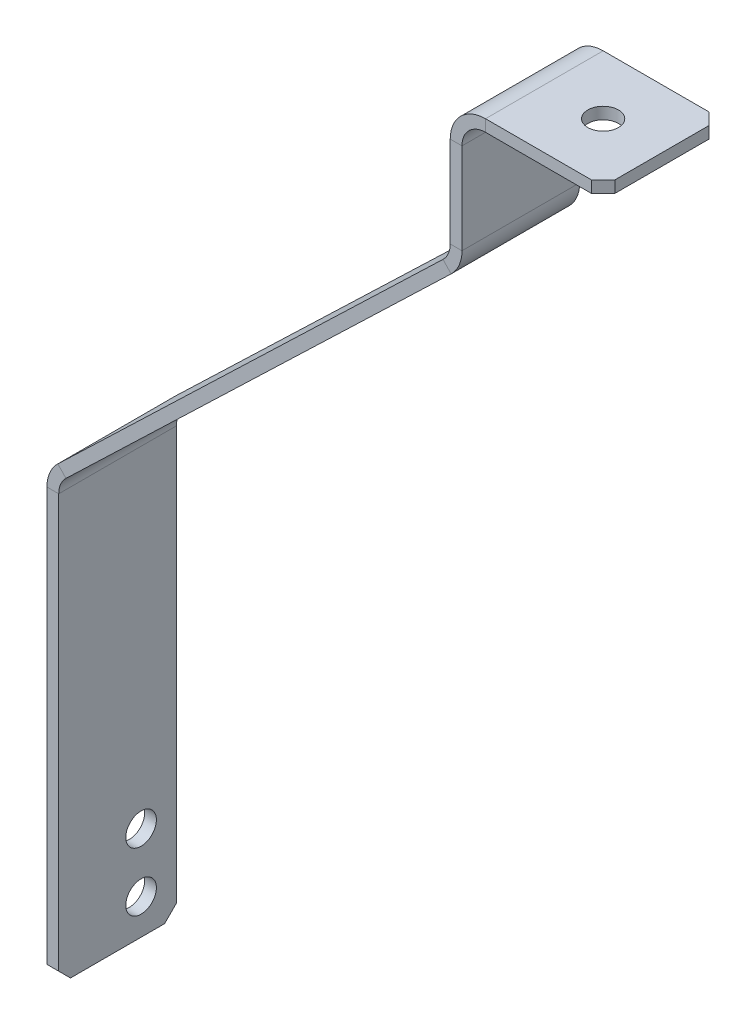
ISO-10303-21;
HEADER;
FILE_DESCRIPTION(('STEP AP214'),'2;1');
FILE_NAME('part.step','',(''),(''),'','','');
FILE_SCHEMA(('AUTOMOTIVE_DESIGN { 1 0 10303 214 1 1 1 1 }'));
ENDSEC;
DATA;
#1=APPLICATION_CONTEXT('core data for automotive mechanical design processes');
#2=APPLICATION_PROTOCOL_DEFINITION('international standard','automotive_design',2000,#1);
#3=PRODUCT_CONTEXT('',#1,'mechanical');
#4=PRODUCT('Part','Part','',(#3));
#5=PRODUCT_RELATED_PRODUCT_CATEGORY('part','',(#4));
#6=PRODUCT_DEFINITION_FORMATION('','',#4);
#7=PRODUCT_DEFINITION_CONTEXT('part definition',#1,'design');
#8=PRODUCT_DEFINITION('design','',#6,#7);
#9=PRODUCT_DEFINITION_SHAPE('','',#8);
#10=(LENGTH_UNIT() NAMED_UNIT(*) SI_UNIT(.MILLI.,.METRE.));
#11=(NAMED_UNIT(*) PLANE_ANGLE_UNIT() SI_UNIT($,.RADIAN.));
#12=(NAMED_UNIT(*) SI_UNIT($,.STERADIAN.) SOLID_ANGLE_UNIT());
#13=UNCERTAINTY_MEASURE_WITH_UNIT(LENGTH_MEASURE(1.E-05),#10,'distance_accuracy_value','');
#14=(GEOMETRIC_REPRESENTATION_CONTEXT(3) GLOBAL_UNCERTAINTY_ASSIGNED_CONTEXT((#13)) GLOBAL_UNIT_ASSIGNED_CONTEXT((#10,
#11,#12)) REPRESENTATION_CONTEXT('',''));
#15=CARTESIAN_POINT('',(0.,0.,0.));
#16=DIRECTION('',(0.,0.,1.));
#17=DIRECTION('',(1.,0.,0.));
#18=AXIS2_PLACEMENT_3D('',#15,#16,#17);
#19=CARTESIAN_POINT('',(171.4,394.5,50.));
#20=DIRECTION('',(0.,0.,1.));
#21=DIRECTION('',(1.,0.,0.));
#22=AXIS2_PLACEMENT_3D('',#19,#20,#21);
#23=PLANE('',#22);
#24=DIRECTION('',(-1.,0.,0.));
#25=VECTOR('',#24,1.);
#26=CARTESIAN_POINT('',(171.4,394.5,50.));
#27=LINE('',#26,#25);
#28=CARTESIAN_POINT('',(171.4,394.5,50.));
#29=VERTEX_POINT('',#28);
#30=CARTESIAN_POINT('',(166.4,394.5,50.));
#31=VERTEX_POINT('',#30);
#32=EDGE_CURVE('E344',#29,#31,#27,.T.);
#33=ORIENTED_EDGE('',*,*,#32,.F.);
#34=CARTESIAN_POINT('',(181.4,394.5,50.));
#35=DIRECTION('',(0.,0.,-1.));
#36=DIRECTION('',(-1.,0.,0.));
#37=AXIS2_PLACEMENT_3D('',#34,#35,#36);
#38=CIRCLE('',#37,10.);
#39=CARTESIAN_POINT('',(181.4,404.5,50.));
#40=VERTEX_POINT('',#39);
#41=EDGE_CURVE('E228',#40,#29,#38,.F.);
#42=ORIENTED_EDGE('',*,*,#41,.F.);
#43=DIRECTION('',(0.,-1.,0.));
#44=VECTOR('',#43,1.);
#45=CARTESIAN_POINT('',(181.4,409.5,50.));
#46=LINE('',#45,#44);
#47=CARTESIAN_POINT('',(181.4,409.5,50.));
#48=VERTEX_POINT('',#47);
#49=EDGE_CURVE('E341',#48,#40,#46,.T.);
#50=ORIENTED_EDGE('',*,*,#49,.F.);
#51=CARTESIAN_POINT('',(181.4,394.5,50.));
#52=DIRECTION('',(0.,0.,1.));
#53=DIRECTION('',(1.,0.,0.));
#54=AXIS2_PLACEMENT_3D('',#51,#52,#53);
#55=CIRCLE('',#54,15.);
#56=EDGE_CURVE('E235',#48,#31,#55,.T.);
#57=ORIENTED_EDGE('',*,*,#56,.T.);
#58=EDGE_LOOP('',(#33,#42,#50,#57));
#59=FACE_BOUND('',#58,.T.);
#60=ADVANCED_FACE('F47',(#59),#23,.T.);
#61=CARTESIAN_POINT('',(181.4,409.5,50.));
#62=DIRECTION('',(0.,0.,1.));
#63=DIRECTION('',(1.,0.,0.));
#64=AXIS2_PLACEMENT_3D('',#61,#62,#63);
#65=PLANE('',#64);
#66=DIRECTION('',(0.,-1.,0.));
#67=VECTOR('',#66,1.);
#68=CARTESIAN_POINT('',(171.4,404.5,50.));
#69=LINE('',#68,#67);
#70=CARTESIAN_POINT('',(171.4,355.894452276752,50.));
#71=VERTEX_POINT('',#70);
#72=EDGE_CURVE('E225',#29,#71,#69,.T.);
#73=ORIENTED_EDGE('',*,*,#72,.F.);
#74=ORIENTED_EDGE('',*,*,#32,.T.);
#75=DIRECTION('',(0.,-1.,0.));
#76=VECTOR('',#75,1.);
#77=CARTESIAN_POINT('',(166.4,404.5,50.));
#78=LINE('',#77,#76);
#79=CARTESIAN_POINT('',(166.4,355.894452276752,50.));
#80=VERTEX_POINT('',#79);
#81=EDGE_CURVE('E238',#31,#80,#78,.T.);
#82=ORIENTED_EDGE('',*,*,#81,.T.);
#83=DIRECTION('',(1.,0.,0.));
#84=VECTOR('',#83,1.);
#85=CARTESIAN_POINT('',(166.4,355.894452276752,50.));
#86=LINE('',#85,#84);
#87=EDGE_CURVE('E332',#80,#71,#86,.T.);
#88=ORIENTED_EDGE('',*,*,#87,.T.);
#89=EDGE_LOOP('',(#73,#74,#82,#88));
#90=FACE_BOUND('',#89,.T.);
#91=ADVANCED_FACE('F493',(#90),#65,.T.);
#92=CARTESIAN_POINT('',(181.4,404.5,0.));
#93=DIRECTION('',(0.,0.,-1.));
#94=DIRECTION('',(-1.,0.,0.));
#95=AXIS2_PLACEMENT_3D('',#92,#93,#94);
#96=PLANE('',#95);
#97=DIRECTION('',(0.,1.,0.));
#98=VECTOR('',#97,1.);
#99=CARTESIAN_POINT('',(181.4,404.5,0.));
#100=LINE('',#99,#98);
#101=CARTESIAN_POINT('',(181.4,404.5,0.));
#102=VERTEX_POINT('',#101);
#103=CARTESIAN_POINT('',(181.4,409.5,0.));
#104=VERTEX_POINT('',#103);
#105=EDGE_CURVE('E338',#102,#104,#100,.T.);
#106=ORIENTED_EDGE('',*,*,#105,.F.);
#107=CARTESIAN_POINT('',(181.4,394.5,0.));
#108=DIRECTION('',(0.,0.,-1.));
#109=DIRECTION('',(-1.,0.,0.));
#110=AXIS2_PLACEMENT_3D('',#107,#108,#109);
#111=CIRCLE('',#110,10.);
#112=CARTESIAN_POINT('',(171.4,394.5,0.));
#113=VERTEX_POINT('',#112);
#114=EDGE_CURVE('E265',#102,#113,#111,.F.);
#115=ORIENTED_EDGE('',*,*,#114,.T.);
#116=DIRECTION('',(1.,0.,0.));
#117=VECTOR('',#116,1.);
#118=CARTESIAN_POINT('',(166.4,394.5,0.));
#119=LINE('',#118,#117);
#120=CARTESIAN_POINT('',(166.4,394.5,0.));
#121=VERTEX_POINT('',#120);
#122=EDGE_CURVE('E336',#121,#113,#119,.T.);
#123=ORIENTED_EDGE('',*,*,#122,.F.);
#124=CARTESIAN_POINT('',(181.4,394.5,0.));
#125=DIRECTION('',(0.,0.,1.));
#126=DIRECTION('',(1.,0.,0.));
#127=AXIS2_PLACEMENT_3D('',#124,#125,#126);
#128=CIRCLE('',#127,15.);
#129=EDGE_CURVE('E272',#104,#121,#128,.T.);
#130=ORIENTED_EDGE('',*,*,#129,.F.);
#131=EDGE_LOOP('',(#106,#115,#123,#130));
#132=FACE_BOUND('',#131,.T.);
#133=ADVANCED_FACE('F457',(#132),#96,.T.);
#134=CARTESIAN_POINT('',(166.4,394.5,0.));
#135=DIRECTION('',(0.,0.,-1.));
#136=DIRECTION('',(-1.,0.,0.));
#137=AXIS2_PLACEMENT_3D('',#134,#135,#136);
#138=PLANE('',#137);
#139=DIRECTION('',(-1.,0.,0.));
#140=VECTOR('',#139,1.);
#141=CARTESIAN_POINT('',(231.4,409.5,0.));
#142=LINE('',#141,#140);
#143=CARTESIAN_POINT('',(226.4,409.5,0.));
#144=VERTEX_POINT('',#143);
#145=EDGE_CURVE('E270',#144,#104,#142,.T.);
#146=ORIENTED_EDGE('',*,*,#145,.F.);
#147=DIRECTION('',(0.,-1.,0.));
#148=VECTOR('',#147,1.);
#149=CARTESIAN_POINT('',(226.4,394.5,0.));
#150=LINE('',#149,#148);
#151=CARTESIAN_POINT('',(226.4,404.5,0.));
#152=VERTEX_POINT('',#151);
#153=EDGE_CURVE('E346',#144,#152,#150,.T.);
#154=ORIENTED_EDGE('',*,*,#153,.T.);
#155=DIRECTION('',(-1.,0.,0.));
#156=VECTOR('',#155,1.);
#157=CARTESIAN_POINT('',(231.4,404.5,0.));
#158=LINE('',#157,#156);
#159=EDGE_CURVE('E268',#152,#102,#158,.T.);
#160=ORIENTED_EDGE('',*,*,#159,.T.);
#161=ORIENTED_EDGE('',*,*,#105,.T.);
#162=EDGE_LOOP('',(#146,#154,#160,#161));
#163=FACE_BOUND('',#162,.T.);
#164=ADVANCED_FACE('F451',(#163),#138,.T.);
#165=CARTESIAN_POINT('',(166.786531576368,345.072254634263,50.));
#166=DIRECTION('',(0.,0.,1.));
#167=DIRECTION('',(1.,0.,0.));
#168=AXIS2_PLACEMENT_3D('',#165,#166,#167);
#169=PLANE('',#168);
#170=DIRECTION('',(-0.692435438424552,0.721479842832632,0.));
#171=VECTOR('',#170,1.);
#172=CARTESIAN_POINT('',(166.786531576368,345.072254634263,50.));
#173=LINE('',#172,#171);
#174=CARTESIAN_POINT('',(166.786531576368,345.072254634263,50.));
#175=VERTEX_POINT('',#174);
#176=CARTESIAN_POINT('',(163.324354384245,348.679653848426,50.));
#177=VERTEX_POINT('',#176);
#178=EDGE_CURVE('E334',#175,#177,#173,.T.);
#179=ORIENTED_EDGE('',*,*,#178,.F.);
#180=CARTESIAN_POINT('',(156.4,355.894452276752,50.));
#181=DIRECTION('',(0.,0.,1.));
#182=DIRECTION('',(1.,0.,0.));
#183=AXIS2_PLACEMENT_3D('',#180,#181,#182);
#184=CIRCLE('',#183,15.);
#185=EDGE_CURVE('E219',#71,#175,#184,.F.);
#186=ORIENTED_EDGE('',*,*,#185,.F.);
#187=ORIENTED_EDGE('',*,*,#87,.F.);
#188=CARTESIAN_POINT('',(156.4,355.894452276752,50.));
#189=DIRECTION('',(0.,0.,1.));
#190=DIRECTION('',(1.,0.,0.));
#191=AXIS2_PLACEMENT_3D('',#188,#189,#190);
#192=CIRCLE('',#191,10.);
#193=EDGE_CURVE('E241',#80,#177,#192,.F.);
#194=ORIENTED_EDGE('',*,*,#193,.T.);
#195=EDGE_LOOP('',(#179,#186,#187,#194));
#196=FACE_BOUND('',#195,.T.);
#197=ADVANCED_FACE('F491',(#196),#169,.T.);
#198=CARTESIAN_POINT('',(166.4,355.894452276752,50.));
#199=DIRECTION('',(0.,0.,1.));
#200=DIRECTION('',(1.,0.,0.));
#201=AXIS2_PLACEMENT_3D('',#198,#199,#200);
#202=PLANE('',#201);
#203=DIRECTION('',(-0.721479842832632,-0.692435438424551,0.));
#204=VECTOR('',#203,1.);
#205=CARTESIAN_POINT('',(171.4,349.5,50.));
#206=LINE('',#205,#204);
#207=CARTESIAN_POINT('',(3.07564561575435,187.951830243825,50.));
#208=VERTEX_POINT('',#207);
#209=EDGE_CURVE('E217',#175,#208,#206,.T.);
#210=ORIENTED_EDGE('',*,*,#209,.F.);
#211=ORIENTED_EDGE('',*,*,#178,.T.);
#212=DIRECTION('',(-0.721479842832632,-0.692435438424551,0.));
#213=VECTOR('',#212,1.);
#214=CARTESIAN_POINT('',(167.937822807877,353.107399214163,50.));
#215=LINE('',#214,#213);
#216=CARTESIAN_POINT('',(-0.386531576368393,191.559229457988,50.));
#217=VERTEX_POINT('',#216);
#218=EDGE_CURVE('E244',#177,#217,#215,.T.);
#219=ORIENTED_EDGE('',*,*,#218,.T.);
#220=DIRECTION('',(0.692435438424555,-0.721479842832629,0.));
#221=VECTOR('',#220,1.);
#222=CARTESIAN_POINT('',(-0.386531576368393,191.559229457988,50.));
#223=LINE('',#222,#221);
#224=EDGE_CURVE('E194',#217,#208,#223,.T.);
#225=ORIENTED_EDGE('',*,*,#224,.T.);
#226=EDGE_LOOP('',(#210,#211,#219,#225));
#227=FACE_BOUND('',#226,.T.);
#228=ADVANCED_FACE('F773',(#227),#202,.T.);
#229=CARTESIAN_POINT('',(171.4,355.894452276752,0.));
#230=DIRECTION('',(0.,0.,-1.));
#231=DIRECTION('',(-1.,0.,0.));
#232=AXIS2_PLACEMENT_3D('',#229,#230,#231);
#233=PLANE('',#232);
#234=DIRECTION('',(-1.,0.,0.));
#235=VECTOR('',#234,1.);
#236=CARTESIAN_POINT('',(171.4,355.894452276752,0.));
#237=LINE('',#236,#235);
#238=CARTESIAN_POINT('',(171.4,355.894452276752,0.));
#239=VERTEX_POINT('',#238);
#240=CARTESIAN_POINT('',(166.4,355.894452276752,0.));
#241=VERTEX_POINT('',#240);
#242=EDGE_CURVE('E330',#239,#241,#237,.T.);
#243=ORIENTED_EDGE('',*,*,#242,.F.);
#244=CARTESIAN_POINT('',(156.4,355.894452276752,0.));
#245=DIRECTION('',(0.,0.,1.));
#246=DIRECTION('',(1.,0.,0.));
#247=AXIS2_PLACEMENT_3D('',#244,#245,#246);
#248=CIRCLE('',#247,15.);
#249=CARTESIAN_POINT('',(166.786531576368,345.072254634263,0.));
#250=VERTEX_POINT('',#249);
#251=EDGE_CURVE('E259',#239,#250,#248,.F.);
#252=ORIENTED_EDGE('',*,*,#251,.T.);
#253=DIRECTION('',(0.692435438424552,-0.721479842832632,0.));
#254=VECTOR('',#253,1.);
#255=CARTESIAN_POINT('',(163.324354384245,348.679653848426,0.));
#256=LINE('',#255,#254);
#257=CARTESIAN_POINT('',(163.324354384245,348.679653848426,0.));
#258=VERTEX_POINT('',#257);
#259=EDGE_CURVE('E193',#258,#250,#256,.T.);
#260=ORIENTED_EDGE('',*,*,#259,.F.);
#261=CARTESIAN_POINT('',(156.4,355.894452276752,0.));
#262=DIRECTION('',(0.,0.,1.));
#263=DIRECTION('',(1.,0.,0.));
#264=AXIS2_PLACEMENT_3D('',#261,#262,#263);
#265=CIRCLE('',#264,10.);
#266=EDGE_CURVE('E278',#241,#258,#265,.F.);
#267=ORIENTED_EDGE('',*,*,#266,.F.);
#268=EDGE_LOOP('',(#243,#252,#260,#267));
#269=FACE_BOUND('',#268,.T.);
#270=ADVANCED_FACE('F479',(#269),#233,.T.);
#271=CARTESIAN_POINT('',(163.324354384245,348.679653848426,0.));
#272=DIRECTION('',(0.,0.,-1.));
#273=DIRECTION('',(-1.,0.,0.));
#274=AXIS2_PLACEMENT_3D('',#271,#272,#273);
#275=PLANE('',#274);
#276=DIRECTION('',(0.,-1.,0.));
#277=VECTOR('',#276,1.);
#278=CARTESIAN_POINT('',(171.4,404.5,0.));
#279=LINE('',#278,#277);
#280=EDGE_CURVE('E262',#113,#239,#279,.T.);
#281=ORIENTED_EDGE('',*,*,#280,.T.);
#282=ORIENTED_EDGE('',*,*,#242,.T.);
#283=DIRECTION('',(0.,-1.,0.));
#284=VECTOR('',#283,1.);
#285=CARTESIAN_POINT('',(166.4,404.5,0.));
#286=LINE('',#285,#284);
#287=EDGE_CURVE('E275',#121,#241,#286,.T.);
#288=ORIENTED_EDGE('',*,*,#287,.F.);
#289=ORIENTED_EDGE('',*,*,#122,.T.);
#290=EDGE_LOOP('',(#281,#282,#288,#289));
#291=FACE_BOUND('',#290,.T.);
#292=ADVANCED_FACE('F461',(#291),#275,.T.);
#293=CARTESIAN_POINT('',(0.,180.737031815499,50.));
#294=DIRECTION('',(0.,0.,1.));
#295=DIRECTION('',(1.,0.,0.));
#296=AXIS2_PLACEMENT_3D('',#293,#294,#295);
#297=PLANE('',#296);
#298=DIRECTION('',(-1.,0.,0.));
#299=VECTOR('',#298,1.);
#300=CARTESIAN_POINT('',(0.,180.737031815499,50.));
#301=LINE('',#300,#299);
#302=CARTESIAN_POINT('',(0.,180.737031815499,50.));
#303=VERTEX_POINT('',#302);
#304=CARTESIAN_POINT('',(-5.00000000000002,180.737031815499,50.));
#305=VERTEX_POINT('',#304);
#306=EDGE_CURVE('E184',#303,#305,#301,.T.);
#307=ORIENTED_EDGE('',*,*,#306,.F.);
#308=CARTESIAN_POINT('',(9.99999999999994,180.737031815499,50.));
#309=DIRECTION('',(0.,0.,-1.));
#310=DIRECTION('',(-1.,0.,0.));
#311=AXIS2_PLACEMENT_3D('',#308,#309,#310);
#312=CIRCLE('',#311,10.);
#313=EDGE_CURVE('E188',#208,#303,#312,.F.);
#314=ORIENTED_EDGE('',*,*,#313,.F.);
#315=ORIENTED_EDGE('',*,*,#224,.F.);
#316=CARTESIAN_POINT('',(9.99999999999994,180.737031815499,50.));
#317=DIRECTION('',(0.,0.,1.));
#318=DIRECTION('',(1.,0.,0.));
#319=AXIS2_PLACEMENT_3D('',#316,#317,#318);
#320=CIRCLE('',#319,15.);
#321=EDGE_CURVE('E191',#217,#305,#320,.T.);
#322=ORIENTED_EDGE('',*,*,#321,.T.);
#323=EDGE_LOOP('',(#307,#314,#315,#322));
#324=FACE_BOUND('',#323,.T.);
#325=ADVANCED_FACE('F186',(#324),#297,.T.);
#326=CARTESIAN_POINT('',(-0.386531576368393,191.559229457988,50.));
#327=DIRECTION('',(0.,0.,1.));
#328=DIRECTION('',(1.,0.,0.));
#329=AXIS2_PLACEMENT_3D('',#326,#327,#328);
#330=PLANE('',#329);
#331=DIRECTION('',(0.,-1.,0.));
#332=VECTOR('',#331,1.);
#333=CARTESIAN_POINT('',(-5.00000000000002,185.,50.));
#334=LINE('',#333,#332);
#335=CARTESIAN_POINT('',(-5.,5.,50.));
#336=VERTEX_POINT('',#335);
#337=EDGE_CURVE('E212',#305,#336,#334,.T.);
#338=ORIENTED_EDGE('',*,*,#337,.T.);
#339=DIRECTION('',(1.,0.,0.));
#340=VECTOR('',#339,1.);
#341=CARTESIAN_POINT('',(-0.386531576368393,5.,50.));
#342=LINE('',#341,#340);
#343=CARTESIAN_POINT('',(0.,5.,50.));
#344=VERTEX_POINT('',#343);
#345=EDGE_CURVE('E55',#336,#344,#342,.T.);
#346=ORIENTED_EDGE('',*,*,#345,.T.);
#347=DIRECTION('',(0.,-1.,0.));
#348=VECTOR('',#347,1.);
#349=CARTESIAN_POINT('',(0.,185.,50.));
#350=LINE('',#349,#348);
#351=EDGE_CURVE('E201',#303,#344,#350,.T.);
#352=ORIENTED_EDGE('',*,*,#351,.F.);
#353=ORIENTED_EDGE('',*,*,#306,.T.);
#354=EDGE_LOOP('',(#338,#346,#352,#353));
#355=FACE_BOUND('',#354,.T.);
#356=ADVANCED_FACE('F211',(#355),#330,.T.);
#357=CARTESIAN_POINT('',(3.07564561575435,187.951830243825,0.));
#358=DIRECTION('',(0.,0.,-1.));
#359=DIRECTION('',(-1.,0.,0.));
#360=AXIS2_PLACEMENT_3D('',#357,#358,#359);
#361=PLANE('',#360);
#362=DIRECTION('',(-0.692435438424555,0.721479842832629,0.));
#363=VECTOR('',#362,1.);
#364=CARTESIAN_POINT('',(3.07564561575435,187.951830243825,0.));
#365=LINE('',#364,#363);
#366=CARTESIAN_POINT('',(3.07564561575435,187.951830243825,0.));
#367=VERTEX_POINT('',#366);
#368=CARTESIAN_POINT('',(-0.386531576368393,191.559229457988,0.));
#369=VERTEX_POINT('',#368);
#370=EDGE_CURVE('E326',#367,#369,#365,.T.);
#371=ORIENTED_EDGE('',*,*,#370,.F.);
#372=CARTESIAN_POINT('',(9.99999999999994,180.737031815499,0.));
#373=DIRECTION('',(0.,0.,-1.));
#374=DIRECTION('',(-1.,0.,0.));
#375=AXIS2_PLACEMENT_3D('',#372,#373,#374);
#376=CIRCLE('',#375,10.);
#377=CARTESIAN_POINT('',(0.,180.737031815499,0.));
#378=VERTEX_POINT('',#377);
#379=EDGE_CURVE('E254',#367,#378,#376,.F.);
#380=ORIENTED_EDGE('',*,*,#379,.T.);
#381=DIRECTION('',(1.,0.,0.));
#382=VECTOR('',#381,1.);
#383=CARTESIAN_POINT('',(-5.00000000000002,180.737031815499,0.));
#384=LINE('',#383,#382);
#385=CARTESIAN_POINT('',(-5.00000000000002,180.737031815499,0.));
#386=VERTEX_POINT('',#385);
#387=EDGE_CURVE('E324',#386,#378,#384,.T.);
#388=ORIENTED_EDGE('',*,*,#387,.F.);
#389=CARTESIAN_POINT('',(9.99999999999994,180.737031815499,0.));
#390=DIRECTION('',(0.,0.,1.));
#391=DIRECTION('',(1.,0.,0.));
#392=AXIS2_PLACEMENT_3D('',#389,#390,#391);
#393=CIRCLE('',#392,15.);
#394=EDGE_CURVE('E284',#369,#386,#393,.T.);
#395=ORIENTED_EDGE('',*,*,#394,.F.);
#396=EDGE_LOOP('',(#371,#380,#388,#395));
#397=FACE_BOUND('',#396,.T.);
#398=ADVANCED_FACE('F402',(#397),#361,.T.);
#399=CARTESIAN_POINT('',(-5.00000000000002,180.737031815499,0.));
#400=DIRECTION('',(0.,0.,-1.));
#401=DIRECTION('',(-1.,0.,0.));
#402=AXIS2_PLACEMENT_3D('',#399,#400,#401);
#403=PLANE('',#402);
#404=DIRECTION('',(-0.721479842832632,-0.692435438424551,0.));
#405=VECTOR('',#404,1.);
#406=CARTESIAN_POINT('',(171.4,349.5,0.));
#407=LINE('',#406,#405);
#408=EDGE_CURVE('E256',#250,#367,#407,.T.);
#409=ORIENTED_EDGE('',*,*,#408,.T.);
#410=ORIENTED_EDGE('',*,*,#370,.T.);
#411=DIRECTION('',(-0.721479842832632,-0.692435438424551,0.));
#412=VECTOR('',#411,1.);
#413=CARTESIAN_POINT('',(167.937822807877,353.107399214163,0.));
#414=LINE('',#413,#412);
#415=EDGE_CURVE('E281',#258,#369,#414,.T.);
#416=ORIENTED_EDGE('',*,*,#415,.F.);
#417=ORIENTED_EDGE('',*,*,#259,.T.);
#418=EDGE_LOOP('',(#409,#410,#416,#417));
#419=FACE_BOUND('',#418,.T.);
#420=ADVANCED_FACE('F721',(#419),#403,.T.);
#421=CARTESIAN_POINT('',(-5.00000000000002,185.,50.));
#422=DIRECTION('',(1.,0.,0.));
#423=DIRECTION('',(0.,1.,0.));
#424=AXIS2_PLACEMENT_3D('',#421,#422,#423);
#425=PLANE('',#424);
#426=CARTESIAN_POINT('',(-5.,15.,15.));
#427=DIRECTION('',(-1.,0.,0.));
#428=DIRECTION('',(0.,-1.,0.));
#429=AXIS2_PLACEMENT_3D('',#426,#427,#428);
#430=CIRCLE('',#429,6.5);
#431=CARTESIAN_POINT('',(-5.,8.5,15.));
#432=VERTEX_POINT('',#431);
#433=EDGE_CURVE('E350',#432,#432,#430,.T.);
#434=ORIENTED_EDGE('',*,*,#433,.F.);
#435=EDGE_LOOP('',(#434));
#436=FACE_BOUND('',#435,.T.);
#437=CARTESIAN_POINT('',(-5.,40.,15.));
#438=DIRECTION('',(-1.,0.,0.));
#439=DIRECTION('',(0.,-1.,0.));
#440=AXIS2_PLACEMENT_3D('',#437,#438,#439);
#441=CIRCLE('',#440,6.5);
#442=CARTESIAN_POINT('',(-5.,33.5,15.));
#443=VERTEX_POINT('',#442);
#444=EDGE_CURVE('E407',#443,#443,#441,.T.);
#445=ORIENTED_EDGE('',*,*,#444,.F.);
#446=EDGE_LOOP('',(#445));
#447=FACE_BOUND('',#446,.T.);
#448=DIRECTION('',(0.,0.,-1.));
#449=VECTOR('',#448,1.);
#450=CARTESIAN_POINT('',(-5.,0.,50.));
#451=LINE('',#450,#449);
#452=CARTESIAN_POINT('',(-5.,0.,45.));
#453=VERTEX_POINT('',#452);
#454=CARTESIAN_POINT('',(-5.,0.,5.));
#455=VERTEX_POINT('',#454);
#456=EDGE_CURVE('E322',#453,#455,#451,.T.);
#457=ORIENTED_EDGE('',*,*,#456,.F.);
#458=DIRECTION('',(0.,-0.707106781186548,-0.707106781186547));
#459=VECTOR('',#458,1.);
#460=CARTESIAN_POINT('',(-5.,0.,45.));
#461=LINE('',#460,#459);
#462=EDGE_CURVE('E69',#453,#336,#461,.F.);
#463=ORIENTED_EDGE('',*,*,#462,.T.);
#464=ORIENTED_EDGE('',*,*,#337,.F.);
#465=DIRECTION('',(0.,0.,-1.));
#466=VECTOR('',#465,1.);
#467=CARTESIAN_POINT('',(-5.00000000000002,180.737031815499,50.));
#468=LINE('',#467,#466);
#469=EDGE_CURVE('E248',#305,#386,#468,.T.);
#470=ORIENTED_EDGE('',*,*,#469,.T.);
#471=DIRECTION('',(0.,-1.,0.));
#472=VECTOR('',#471,1.);
#473=CARTESIAN_POINT('',(-5.00000000000002,185.,0.));
#474=LINE('',#473,#472);
#475=CARTESIAN_POINT('',(-5.,5.,0.));
#476=VERTEX_POINT('',#475);
#477=EDGE_CURVE('E249',#386,#476,#474,.T.);
#478=ORIENTED_EDGE('',*,*,#477,.T.);
#479=DIRECTION('',(0.,0.707106781186548,-0.707106781186547));
#480=VECTOR('',#479,1.);
#481=CARTESIAN_POINT('',(-5.,5.,0.));
#482=LINE('',#481,#480);
#483=EDGE_CURVE('E375',#476,#455,#482,.F.);
#484=ORIENTED_EDGE('',*,*,#483,.T.);
#485=EDGE_LOOP('',(#457,#463,#464,#470,#478,#484));
#486=FACE_BOUND('',#485,.T.);
#487=ADVANCED_FACE('F391',(#436,#447,#486),#425,.F.);
#488=CARTESIAN_POINT('',(0.,0.,50.));
#489=DIRECTION('',(0.,-1.,0.));
#490=DIRECTION('',(0.,0.,-1.));
#491=AXIS2_PLACEMENT_3D('',#488,#489,#490);
#492=PLANE('',#491);
#493=DIRECTION('',(0.,0.,-1.));
#494=VECTOR('',#493,1.);
#495=CARTESIAN_POINT('',(0.,0.,50.));
#496=LINE('',#495,#494);
#497=CARTESIAN_POINT('',(0.,0.,45.));
#498=VERTEX_POINT('',#497);
#499=CARTESIAN_POINT('',(0.,0.,5.));
#500=VERTEX_POINT('',#499);
#501=EDGE_CURVE('E208',#498,#500,#496,.T.);
#502=ORIENTED_EDGE('',*,*,#501,.F.);
#503=DIRECTION('',(-1.,0.,0.));
#504=VECTOR('',#503,1.);
#505=CARTESIAN_POINT('',(0.,0.,45.));
#506=LINE('',#505,#504);
#507=EDGE_CURVE('E383',#498,#453,#506,.T.);
#508=ORIENTED_EDGE('',*,*,#507,.T.);
#509=ORIENTED_EDGE('',*,*,#456,.T.);
#510=DIRECTION('',(1.,0.,0.));
#511=VECTOR('',#510,1.);
#512=CARTESIAN_POINT('',(0.,0.,5.));
#513=LINE('',#512,#511);
#514=EDGE_CURVE('E378',#455,#500,#513,.T.);
#515=ORIENTED_EDGE('',*,*,#514,.T.);
#516=EDGE_LOOP('',(#502,#508,#509,#515));
#517=FACE_BOUND('',#516,.T.);
#518=ADVANCED_FACE('F389',(#517),#492,.T.);
#519=CARTESIAN_POINT('',(0.,185.,50.));
#520=DIRECTION('',(1.,0.,0.));
#521=DIRECTION('',(0.,1.,0.));
#522=AXIS2_PLACEMENT_3D('',#519,#520,#521);
#523=PLANE('',#522);
#524=CARTESIAN_POINT('',(0.,15.,15.));
#525=DIRECTION('',(1.,0.,0.));
#526=DIRECTION('',(0.,1.,0.));
#527=AXIS2_PLACEMENT_3D('',#524,#525,#526);
#528=CIRCLE('',#527,6.5);
#529=CARTESIAN_POINT('',(0.,21.5,15.));
#530=VERTEX_POINT('',#529);
#531=EDGE_CURVE('E252',#530,#530,#528,.T.);
#532=ORIENTED_EDGE('',*,*,#531,.F.);
#533=EDGE_LOOP('',(#532));
#534=FACE_BOUND('',#533,.T.);
#535=CARTESIAN_POINT('',(0.,40.,15.));
#536=DIRECTION('',(1.,0.,0.));
#537=DIRECTION('',(0.,1.,0.));
#538=AXIS2_PLACEMENT_3D('',#535,#536,#537);
#539=CIRCLE('',#538,6.5);
#540=CARTESIAN_POINT('',(0.,46.5,15.));
#541=VERTEX_POINT('',#540);
#542=EDGE_CURVE('E347',#541,#541,#539,.T.);
#543=ORIENTED_EDGE('',*,*,#542,.F.);
#544=EDGE_LOOP('',(#543));
#545=FACE_BOUND('',#544,.T.);
#546=ORIENTED_EDGE('',*,*,#351,.T.);
#547=DIRECTION('',(0.,0.707106781186548,0.707106781186547));
#548=VECTOR('',#547,1.);
#549=CARTESIAN_POINT('',(0.,95.0000000000001,140.));
#550=LINE('',#549,#548);
#551=EDGE_CURVE('E11',#344,#498,#550,.F.);
#552=ORIENTED_EDGE('',*,*,#551,.T.);
#553=ORIENTED_EDGE('',*,*,#501,.T.);
#554=DIRECTION('',(0.,-0.707106781186548,0.707106781186547));
#555=VECTOR('',#554,1.);
#556=CARTESIAN_POINT('',(0.,70.0000000000001,-65.));
#557=LINE('',#556,#555);
#558=CARTESIAN_POINT('',(0.,5.,0.));
#559=VERTEX_POINT('',#558);
#560=EDGE_CURVE('E381',#500,#559,#557,.F.);
#561=ORIENTED_EDGE('',*,*,#560,.T.);
#562=DIRECTION('',(0.,-1.,0.));
#563=VECTOR('',#562,1.);
#564=CARTESIAN_POINT('',(0.,185.,0.));
#565=LINE('',#564,#563);
#566=EDGE_CURVE('E204',#378,#559,#565,.T.);
#567=ORIENTED_EDGE('',*,*,#566,.F.);
#568=DIRECTION('',(0.,0.,-1.));
#569=VECTOR('',#568,1.);
#570=CARTESIAN_POINT('',(0.,180.737031815499,50.));
#571=LINE('',#570,#569);
#572=EDGE_CURVE('E199',#303,#378,#571,.T.);
#573=ORIENTED_EDGE('',*,*,#572,.F.);
#574=EDGE_LOOP('',(#546,#552,#553,#561,#567,#573));
#575=FACE_BOUND('',#574,.T.);
#576=ADVANCED_FACE('F200',(#534,#545,#575),#523,.T.);
#577=CARTESIAN_POINT('',(9.99999999999994,180.737031815499,50.));
#578=DIRECTION('',(0.,0.,-1.));
#579=DIRECTION('',(-1.,0.,0.));
#580=AXIS2_PLACEMENT_3D('',#577,#578,#579);
#581=CYLINDRICAL_SURFACE('',#580,10.);
#582=ORIENTED_EDGE('',*,*,#379,.F.);
#583=DIRECTION('',(0.,0.,-1.));
#584=VECTOR('',#583,1.);
#585=CARTESIAN_POINT('',(3.07564561575435,187.951830243825,50.));
#586=LINE('',#585,#584);
#587=EDGE_CURVE('E209',#208,#367,#586,.T.);
#588=ORIENTED_EDGE('',*,*,#587,.F.);
#589=ORIENTED_EDGE('',*,*,#313,.T.);
#590=ORIENTED_EDGE('',*,*,#572,.T.);
#591=EDGE_LOOP('',(#582,#588,#589,#590));
#592=FACE_BOUND('',#591,.T.);
#593=ADVANCED_FACE('F215',(#592),#581,.F.);
#594=CARTESIAN_POINT('',(171.4,349.5,50.));
#595=DIRECTION('',(0.692435438424551,-0.721479842832632,0.));
#596=DIRECTION('',(0.721479842832632,0.692435438424551,0.));
#597=AXIS2_PLACEMENT_3D('',#594,#595,#596);
#598=PLANE('',#597);
#599=ORIENTED_EDGE('',*,*,#408,.F.);
#600=DIRECTION('',(0.,0.,-1.));
#601=VECTOR('',#600,1.);
#602=CARTESIAN_POINT('',(166.786531576368,345.072254634263,50.));
#603=LINE('',#602,#601);
#604=EDGE_CURVE('E317',#175,#250,#603,.T.);
#605=ORIENTED_EDGE('',*,*,#604,.F.);
#606=ORIENTED_EDGE('',*,*,#209,.T.);
#607=ORIENTED_EDGE('',*,*,#587,.T.);
#608=EDGE_LOOP('',(#599,#605,#606,#607));
#609=FACE_BOUND('',#608,.T.);
#610=ADVANCED_FACE('F677',(#609),#598,.T.);
#611=CARTESIAN_POINT('',(156.4,355.894452276752,50.));
#612=DIRECTION('',(0.,0.,-1.));
#613=DIRECTION('',(-1.,0.,0.));
#614=AXIS2_PLACEMENT_3D('',#611,#612,#613);
#615=CYLINDRICAL_SURFACE('',#614,15.);
#616=ORIENTED_EDGE('',*,*,#251,.F.);
#617=DIRECTION('',(0.,0.,-1.));
#618=VECTOR('',#617,1.);
#619=CARTESIAN_POINT('',(171.4,355.894452276752,50.));
#620=LINE('',#619,#618);
#621=EDGE_CURVE('E314',#71,#239,#620,.T.);
#622=ORIENTED_EDGE('',*,*,#621,.F.);
#623=ORIENTED_EDGE('',*,*,#185,.T.);
#624=ORIENTED_EDGE('',*,*,#604,.T.);
#625=EDGE_LOOP('',(#616,#622,#623,#624));
#626=FACE_BOUND('',#625,.T.);
#627=ADVANCED_FACE('F475',(#626),#615,.T.);
#628=CARTESIAN_POINT('',(171.4,404.5,50.));
#629=DIRECTION('',(1.,0.,0.));
#630=DIRECTION('',(0.,1.,0.));
#631=AXIS2_PLACEMENT_3D('',#628,#629,#630);
#632=PLANE('',#631);
#633=ORIENTED_EDGE('',*,*,#280,.F.);
#634=DIRECTION('',(0.,0.,-1.));
#635=VECTOR('',#634,1.);
#636=CARTESIAN_POINT('',(171.4,394.5,50.));
#637=LINE('',#636,#635);
#638=EDGE_CURVE('E311',#29,#113,#637,.T.);
#639=ORIENTED_EDGE('',*,*,#638,.F.);
#640=ORIENTED_EDGE('',*,*,#72,.T.);
#641=ORIENTED_EDGE('',*,*,#621,.T.);
#642=EDGE_LOOP('',(#633,#639,#640,#641));
#643=FACE_BOUND('',#642,.T.);
#644=ADVANCED_FACE('F470',(#643),#632,.T.);
#645=CARTESIAN_POINT('',(181.4,394.5,50.));
#646=DIRECTION('',(0.,0.,-1.));
#647=DIRECTION('',(-1.,0.,0.));
#648=AXIS2_PLACEMENT_3D('',#645,#646,#647);
#649=CYLINDRICAL_SURFACE('',#648,10.);
#650=ORIENTED_EDGE('',*,*,#114,.F.);
#651=DIRECTION('',(0.,0.,-1.));
#652=VECTOR('',#651,1.);
#653=CARTESIAN_POINT('',(181.4,404.5,50.));
#654=LINE('',#653,#652);
#655=EDGE_CURVE('E308',#40,#102,#654,.T.);
#656=ORIENTED_EDGE('',*,*,#655,.F.);
#657=ORIENTED_EDGE('',*,*,#41,.T.);
#658=ORIENTED_EDGE('',*,*,#638,.T.);
#659=EDGE_LOOP('',(#650,#656,#657,#658));
#660=FACE_BOUND('',#659,.T.);
#661=ADVANCED_FACE('F465',(#660),#649,.F.);
#662=CARTESIAN_POINT('',(231.4,404.5,50.));
#663=DIRECTION('',(0.,-1.,0.));
#664=DIRECTION('',(1.,0.,0.));
#665=AXIS2_PLACEMENT_3D('',#662,#663,#664);
#666=PLANE('',#665);
#667=CARTESIAN_POINT('',(206.4,404.5,25.));
#668=DIRECTION('',(0.,-1.,0.));
#669=DIRECTION('',(1.,0.,0.));
#670=AXIS2_PLACEMENT_3D('',#667,#668,#669);
#671=CIRCLE('',#670,6.50000000000002);
#672=CARTESIAN_POINT('',(212.9,404.5,25.));
#673=VERTEX_POINT('',#672);
#674=EDGE_CURVE('E410',#673,#673,#671,.T.);
#675=ORIENTED_EDGE('',*,*,#674,.F.);
#676=EDGE_LOOP('',(#675));
#677=FACE_BOUND('',#676,.T.);
#678=DIRECTION('',(0.,0.,-1.));
#679=VECTOR('',#678,1.);
#680=CARTESIAN_POINT('',(231.4,404.5,50.));
#681=LINE('',#680,#679);
#682=CARTESIAN_POINT('',(231.4,404.5,45.));
#683=VERTEX_POINT('',#682);
#684=CARTESIAN_POINT('',(231.4,404.5,5.));
#685=VERTEX_POINT('',#684);
#686=EDGE_CURVE('E306',#683,#685,#681,.T.);
#687=ORIENTED_EDGE('',*,*,#686,.F.);
#688=DIRECTION('',(-0.707106781186548,0.,0.707106781186547));
#689=VECTOR('',#688,1.);
#690=CARTESIAN_POINT('',(228.9,404.5,47.5));
#691=LINE('',#690,#689);
#692=CARTESIAN_POINT('',(226.4,404.5,50.));
#693=VERTEX_POINT('',#692);
#694=EDGE_CURVE('E366',#683,#693,#691,.T.);
#695=ORIENTED_EDGE('',*,*,#694,.T.);
#696=DIRECTION('',(-1.,0.,0.));
#697=VECTOR('',#696,1.);
#698=CARTESIAN_POINT('',(231.4,404.5,50.));
#699=LINE('',#698,#697);
#700=EDGE_CURVE('E231',#693,#40,#699,.T.);
#701=ORIENTED_EDGE('',*,*,#700,.T.);
#702=ORIENTED_EDGE('',*,*,#655,.T.);
#703=ORIENTED_EDGE('',*,*,#159,.F.);
#704=DIRECTION('',(-0.707106781186548,0.,-0.707106781186547));
#705=VECTOR('',#704,1.);
#706=CARTESIAN_POINT('',(253.9,404.5,27.5));
#707=LINE('',#706,#705);
#708=EDGE_CURVE('E355',#152,#685,#707,.F.);
#709=ORIENTED_EDGE('',*,*,#708,.T.);
#710=EDGE_LOOP('',(#687,#695,#701,#702,#703,#709));
#711=FACE_BOUND('',#710,.T.);
#712=ADVANCED_FACE('F441',(#677,#711),#666,.T.);
#713=CARTESIAN_POINT('',(231.4,409.5,50.));
#714=DIRECTION('',(1.,0.,0.));
#715=DIRECTION('',(0.,0.,-1.));
#716=AXIS2_PLACEMENT_3D('',#713,#714,#715);
#717=PLANE('',#716);
#718=DIRECTION('',(0.,0.,-1.));
#719=VECTOR('',#718,1.);
#720=CARTESIAN_POINT('',(231.4,409.5,50.));
#721=LINE('',#720,#719);
#722=CARTESIAN_POINT('',(231.4,409.5,45.));
#723=VERTEX_POINT('',#722);
#724=CARTESIAN_POINT('',(231.4,409.5,5.));
#725=VERTEX_POINT('',#724);
#726=EDGE_CURVE('E304',#723,#725,#721,.T.);
#727=ORIENTED_EDGE('',*,*,#726,.F.);
#728=DIRECTION('',(0.,-1.,0.));
#729=VECTOR('',#728,1.);
#730=CARTESIAN_POINT('',(231.4,404.5,45.));
#731=LINE('',#730,#729);
#732=EDGE_CURVE('E363',#723,#683,#731,.T.);
#733=ORIENTED_EDGE('',*,*,#732,.T.);
#734=ORIENTED_EDGE('',*,*,#686,.T.);
#735=DIRECTION('',(0.,1.,0.));
#736=VECTOR('',#735,1.);
#737=CARTESIAN_POINT('',(231.4,409.5,5.));
#738=LINE('',#737,#736);
#739=EDGE_CURVE('E358',#685,#725,#738,.T.);
#740=ORIENTED_EDGE('',*,*,#739,.T.);
#741=EDGE_LOOP('',(#727,#733,#734,#740));
#742=FACE_BOUND('',#741,.T.);
#743=ADVANCED_FACE('F425',(#742),#717,.T.);
#744=CARTESIAN_POINT('',(231.4,409.5,50.));
#745=DIRECTION('',(0.,-1.,0.));
#746=DIRECTION('',(1.,0.,0.));
#747=AXIS2_PLACEMENT_3D('',#744,#745,#746);
#748=PLANE('',#747);
#749=CARTESIAN_POINT('',(206.4,409.5,25.));
#750=DIRECTION('',(0.,1.,0.));
#751=DIRECTION('',(-1.,0.,0.));
#752=AXIS2_PLACEMENT_3D('',#749,#750,#751);
#753=CIRCLE('',#752,6.50000000000002);
#754=CARTESIAN_POINT('',(199.9,409.5,25.));
#755=VERTEX_POINT('',#754);
#756=EDGE_CURVE('E415',#755,#755,#753,.T.);
#757=ORIENTED_EDGE('',*,*,#756,.F.);
#758=EDGE_LOOP('',(#757));
#759=FACE_BOUND('',#758,.T.);
#760=DIRECTION('',(-1.,0.,0.));
#761=VECTOR('',#760,1.);
#762=CARTESIAN_POINT('',(231.4,409.5,50.));
#763=LINE('',#762,#761);
#764=CARTESIAN_POINT('',(226.4,409.5,50.));
#765=VERTEX_POINT('',#764);
#766=EDGE_CURVE('E233',#765,#48,#763,.T.);
#767=ORIENTED_EDGE('',*,*,#766,.F.);
#768=DIRECTION('',(0.707106781186548,0.,-0.707106781186547));
#769=VECTOR('',#768,1.);
#770=CARTESIAN_POINT('',(231.4,409.5,45.));
#771=LINE('',#770,#769);
#772=EDGE_CURVE('E370',#765,#723,#771,.T.);
#773=ORIENTED_EDGE('',*,*,#772,.T.);
#774=ORIENTED_EDGE('',*,*,#726,.T.);
#775=DIRECTION('',(0.707106781186548,0.,0.707106781186547));
#776=VECTOR('',#775,1.);
#777=CARTESIAN_POINT('',(226.4,409.5,0.));
#778=LINE('',#777,#776);
#779=EDGE_CURVE('E361',#725,#144,#778,.F.);
#780=ORIENTED_EDGE('',*,*,#779,.T.);
#781=ORIENTED_EDGE('',*,*,#145,.T.);
#782=DIRECTION('',(0.,0.,-1.));
#783=VECTOR('',#782,1.);
#784=CARTESIAN_POINT('',(181.4,409.5,50.));
#785=LINE('',#784,#783);
#786=EDGE_CURVE('E301',#48,#104,#785,.T.);
#787=ORIENTED_EDGE('',*,*,#786,.F.);
#788=EDGE_LOOP('',(#767,#773,#774,#780,#781,#787));
#789=FACE_BOUND('',#788,.T.);
#790=ADVANCED_FACE('F421',(#759,#789),#748,.F.);
#791=CARTESIAN_POINT('',(181.4,394.5,50.));
#792=DIRECTION('',(0.,0.,-1.));
#793=DIRECTION('',(-1.,0.,0.));
#794=AXIS2_PLACEMENT_3D('',#791,#792,#793);
#795=CYLINDRICAL_SURFACE('',#794,15.);
#796=ORIENTED_EDGE('',*,*,#129,.T.);
#797=DIRECTION('',(0.,0.,-1.));
#798=VECTOR('',#797,1.);
#799=CARTESIAN_POINT('',(166.4,394.5,50.));
#800=LINE('',#799,#798);
#801=EDGE_CURVE('E298',#31,#121,#800,.T.);
#802=ORIENTED_EDGE('',*,*,#801,.F.);
#803=ORIENTED_EDGE('',*,*,#56,.F.);
#804=ORIENTED_EDGE('',*,*,#786,.T.);
#805=EDGE_LOOP('',(#796,#802,#803,#804));
#806=FACE_BOUND('',#805,.T.);
#807=ADVANCED_FACE('F424',(#806),#795,.T.);
#808=CARTESIAN_POINT('',(166.4,404.5,50.));
#809=DIRECTION('',(1.,0.,0.));
#810=DIRECTION('',(0.,1.,0.));
#811=AXIS2_PLACEMENT_3D('',#808,#809,#810);
#812=PLANE('',#811);
#813=ORIENTED_EDGE('',*,*,#287,.T.);
#814=DIRECTION('',(0.,0.,-1.));
#815=VECTOR('',#814,1.);
#816=CARTESIAN_POINT('',(166.4,355.894452276752,50.));
#817=LINE('',#816,#815);
#818=EDGE_CURVE('E295',#80,#241,#817,.T.);
#819=ORIENTED_EDGE('',*,*,#818,.F.);
#820=ORIENTED_EDGE('',*,*,#81,.F.);
#821=ORIENTED_EDGE('',*,*,#801,.T.);
#822=EDGE_LOOP('',(#813,#819,#820,#821));
#823=FACE_BOUND('',#822,.T.);
#824=ADVANCED_FACE('F483',(#823),#812,.F.);
#825=CARTESIAN_POINT('',(156.4,355.894452276752,50.));
#826=DIRECTION('',(0.,0.,-1.));
#827=DIRECTION('',(-1.,0.,0.));
#828=AXIS2_PLACEMENT_3D('',#825,#826,#827);
#829=CYLINDRICAL_SURFACE('',#828,10.);
#830=ORIENTED_EDGE('',*,*,#266,.T.);
#831=DIRECTION('',(0.,0.,-1.));
#832=VECTOR('',#831,1.);
#833=CARTESIAN_POINT('',(163.324354384245,348.679653848426,50.));
#834=LINE('',#833,#832);
#835=EDGE_CURVE('E292',#177,#258,#834,.T.);
#836=ORIENTED_EDGE('',*,*,#835,.F.);
#837=ORIENTED_EDGE('',*,*,#193,.F.);
#838=ORIENTED_EDGE('',*,*,#818,.T.);
#839=EDGE_LOOP('',(#830,#836,#837,#838));
#840=FACE_BOUND('',#839,.T.);
#841=ADVANCED_FACE('F487',(#840),#829,.F.);
#842=CARTESIAN_POINT('',(167.937822807877,353.107399214163,50.));
#843=DIRECTION('',(0.692435438424551,-0.721479842832632,0.));
#844=DIRECTION('',(0.721479842832632,0.692435438424551,0.));
#845=AXIS2_PLACEMENT_3D('',#842,#843,#844);
#846=PLANE('',#845);
#847=ORIENTED_EDGE('',*,*,#415,.T.);
#848=DIRECTION('',(0.,0.,-1.));
#849=VECTOR('',#848,1.);
#850=CARTESIAN_POINT('',(-0.386531576368393,191.559229457988,50.));
#851=LINE('',#850,#849);
#852=EDGE_CURVE('E289',#217,#369,#851,.T.);
#853=ORIENTED_EDGE('',*,*,#852,.F.);
#854=ORIENTED_EDGE('',*,*,#218,.F.);
#855=ORIENTED_EDGE('',*,*,#835,.T.);
#856=EDGE_LOOP('',(#847,#853,#854,#855));
#857=FACE_BOUND('',#856,.T.);
#858=ADVANCED_FACE('F504',(#857),#846,.F.);
#859=CARTESIAN_POINT('',(9.99999999999994,180.737031815499,50.));
#860=DIRECTION('',(0.,0.,-1.));
#861=DIRECTION('',(-1.,0.,0.));
#862=AXIS2_PLACEMENT_3D('',#859,#860,#861);
#863=CYLINDRICAL_SURFACE('',#862,15.);
#864=ORIENTED_EDGE('',*,*,#394,.T.);
#865=ORIENTED_EDGE('',*,*,#469,.F.);
#866=ORIENTED_EDGE('',*,*,#321,.F.);
#867=ORIENTED_EDGE('',*,*,#852,.T.);
#868=EDGE_LOOP('',(#864,#865,#866,#867));
#869=FACE_BOUND('',#868,.T.);
#870=ADVANCED_FACE('F404',(#869),#863,.T.);
#871=CARTESIAN_POINT('',(9.99999999999994,180.737031815499,50.));
#872=DIRECTION('',(0.,0.,-1.));
#873=DIRECTION('',(-1.,0.,0.));
#874=AXIS2_PLACEMENT_3D('',#871,#872,#873);
#875=PLANE('',#874);
#876=ORIENTED_EDGE('',*,*,#700,.F.);
#877=DIRECTION('',(0.,1.,0.));
#878=VECTOR('',#877,1.);
#879=CARTESIAN_POINT('',(226.4,409.5,50.));
#880=LINE('',#879,#878);
#881=EDGE_CURVE('E368',#693,#765,#880,.T.);
#882=ORIENTED_EDGE('',*,*,#881,.T.);
#883=ORIENTED_EDGE('',*,*,#766,.T.);
#884=ORIENTED_EDGE('',*,*,#49,.T.);
#885=EDGE_LOOP('',(#876,#882,#883,#884));
#886=FACE_BOUND('',#885,.T.);
#887=ADVANCED_FACE('F495',(#886),#875,.F.);
#888=CARTESIAN_POINT('',(9.99999999999994,180.737031815499,0.));
#889=DIRECTION('',(0.,0.,-1.));
#890=DIRECTION('',(-1.,0.,0.));
#891=AXIS2_PLACEMENT_3D('',#888,#889,#890);
#892=PLANE('',#891);
#893=ORIENTED_EDGE('',*,*,#566,.T.);
#894=DIRECTION('',(-1.,0.,0.));
#895=VECTOR('',#894,1.);
#896=CARTESIAN_POINT('',(9.99999999999994,5.,0.));
#897=LINE('',#896,#895);
#898=EDGE_CURVE('E372',#559,#476,#897,.T.);
#899=ORIENTED_EDGE('',*,*,#898,.T.);
#900=ORIENTED_EDGE('',*,*,#477,.F.);
#901=ORIENTED_EDGE('',*,*,#387,.T.);
#902=EDGE_LOOP('',(#893,#899,#900,#901));
#903=FACE_BOUND('',#902,.T.);
#904=ADVANCED_FACE('F399',(#903),#892,.T.);
#905=CARTESIAN_POINT('',(5.,40.,15.));
#906=DIRECTION('',(-1.,0.,0.));
#907=DIRECTION('',(0.,-1.,0.));
#908=AXIS2_PLACEMENT_3D('',#905,#906,#907);
#909=CYLINDRICAL_SURFACE('',#908,6.5);
#910=ORIENTED_EDGE('',*,*,#542,.T.);
#911=EDGE_LOOP('',(#910));
#912=FACE_BOUND('',#911,.T.);
#913=ORIENTED_EDGE('',*,*,#444,.T.);
#914=EDGE_LOOP('',(#913));
#915=FACE_BOUND('',#914,.T.);
#916=ADVANCED_FACE('F501',(#912,#915),#909,.F.);
#917=CARTESIAN_POINT('',(5.,15.,15.));
#918=DIRECTION('',(-1.,0.,0.));
#919=DIRECTION('',(0.,-1.,0.));
#920=AXIS2_PLACEMENT_3D('',#917,#918,#919);
#921=CYLINDRICAL_SURFACE('',#920,6.5);
#922=ORIENTED_EDGE('',*,*,#531,.T.);
#923=EDGE_LOOP('',(#922));
#924=FACE_BOUND('',#923,.T.);
#925=ORIENTED_EDGE('',*,*,#433,.T.);
#926=EDGE_LOOP('',(#925));
#927=FACE_BOUND('',#926,.T.);
#928=ADVANCED_FACE('F551',(#924,#927),#921,.F.);
#929=CARTESIAN_POINT('',(206.4,399.5,25.));
#930=DIRECTION('',(0.,1.,0.));
#931=DIRECTION('',(-1.,0.,0.));
#932=AXIS2_PLACEMENT_3D('',#929,#930,#931);
#933=CYLINDRICAL_SURFACE('',#932,6.50000000000002);
#934=ORIENTED_EDGE('',*,*,#674,.T.);
#935=EDGE_LOOP('',(#934));
#936=FACE_BOUND('',#935,.T.);
#937=ORIENTED_EDGE('',*,*,#756,.T.);
#938=EDGE_LOOP('',(#937));
#939=FACE_BOUND('',#938,.T.);
#940=ADVANCED_FACE('F419',(#936,#939),#933,.F.);
#941=CARTESIAN_POINT('',(226.4,394.5,0.));
#942=DIRECTION('',(-0.707106781186547,0.,0.707106781186548));
#943=DIRECTION('',(0.,-1.,0.));
#944=AXIS2_PLACEMENT_3D('',#941,#942,#943);
#945=PLANE('',#944);
#946=ORIENTED_EDGE('',*,*,#779,.F.);
#947=ORIENTED_EDGE('',*,*,#739,.F.);
#948=ORIENTED_EDGE('',*,*,#708,.F.);
#949=ORIENTED_EDGE('',*,*,#153,.F.);
#950=EDGE_LOOP('',(#946,#947,#948,#949));
#951=FACE_BOUND('',#950,.T.);
#952=ADVANCED_FACE('F448',(#951),#945,.F.);
#953=CARTESIAN_POINT('',(231.4,409.5,45.));
#954=DIRECTION('',(0.707106781186547,0.,0.707106781186548));
#955=DIRECTION('',(0.,1.,0.));
#956=AXIS2_PLACEMENT_3D('',#953,#954,#955);
#957=PLANE('',#956);
#958=ORIENTED_EDGE('',*,*,#772,.F.);
#959=ORIENTED_EDGE('',*,*,#881,.F.);
#960=ORIENTED_EDGE('',*,*,#694,.F.);
#961=ORIENTED_EDGE('',*,*,#732,.F.);
#962=EDGE_LOOP('',(#958,#959,#960,#961));
#963=FACE_BOUND('',#962,.T.);
#964=ADVANCED_FACE('F437',(#963),#957,.T.);
#965=CARTESIAN_POINT('',(9.99999999999994,5.,0.));
#966=DIRECTION('',(0.,0.707106781186547,0.707106781186548));
#967=DIRECTION('',(-1.,0.,0.));
#968=AXIS2_PLACEMENT_3D('',#965,#966,#967);
#969=PLANE('',#968);
#970=ORIENTED_EDGE('',*,*,#560,.F.);
#971=ORIENTED_EDGE('',*,*,#514,.F.);
#972=ORIENTED_EDGE('',*,*,#483,.F.);
#973=ORIENTED_EDGE('',*,*,#898,.F.);
#974=EDGE_LOOP('',(#970,#971,#972,#973));
#975=FACE_BOUND('',#974,.T.);
#976=ADVANCED_FACE('F397',(#975),#969,.F.);
#977=CARTESIAN_POINT('',(0.,0.,45.));
#978=DIRECTION('',(0.,0.707106781186547,-0.707106781186548));
#979=DIRECTION('',(-1.,0.,0.));
#980=AXIS2_PLACEMENT_3D('',#977,#978,#979);
#981=PLANE('',#980);
#982=ORIENTED_EDGE('',*,*,#551,.F.);
#983=ORIENTED_EDGE('',*,*,#345,.F.);
#984=ORIENTED_EDGE('',*,*,#462,.F.);
#985=ORIENTED_EDGE('',*,*,#507,.F.);
#986=EDGE_LOOP('',(#982,#983,#984,#985));
#987=FACE_BOUND('',#986,.T.);
#988=ADVANCED_FACE('F49',(#987),#981,.F.);
#989=CLOSED_SHELL('',(#60,#91,#133,#164,#197,#228,#270,#292,#325,#356,#398,#420,#487,#518,#576,
#593,#610,#627,#644,#661,#712,#743,#790,#807,#824,#841,#858,#870,#887,#904,#916,#928,#940,#952,
#964,#976,#988));
#990=MANIFOLD_SOLID_BREP('B2',#989);
#991=ADVANCED_BREP_SHAPE_REPRESENTATION('',(#18,#990),#14);
#992=SHAPE_DEFINITION_REPRESENTATION(#9,#991);
ENDSEC;
END-ISO-10303-21;
